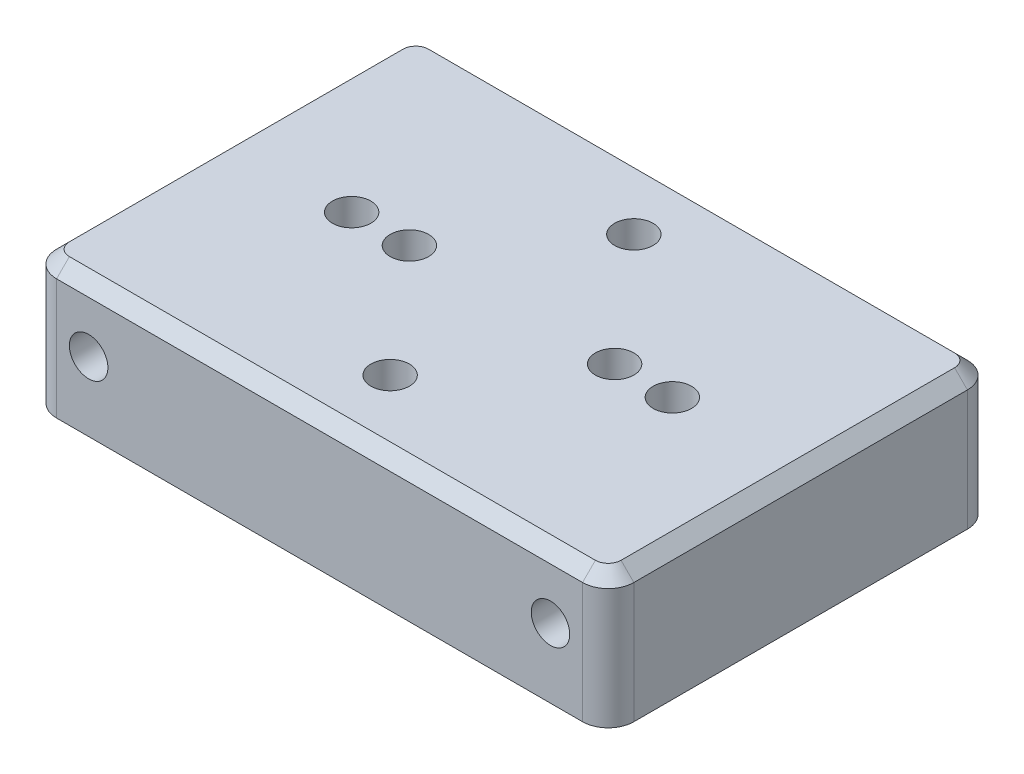
ISO-10303-21;
HEADER;
FILE_DESCRIPTION(('STEP AP214'),'2;1');
FILE_NAME('part.step','',(''),(''),'','','');
FILE_SCHEMA(('AUTOMOTIVE_DESIGN { 1 0 10303 214 1 1 1 1 }'));
ENDSEC;
DATA;
#1=APPLICATION_CONTEXT('core data for automotive mechanical design processes');
#2=APPLICATION_PROTOCOL_DEFINITION('international standard','automotive_design',2000,#1);
#3=PRODUCT_CONTEXT('',#1,'mechanical');
#4=PRODUCT('Part','Part','',(#3));
#5=PRODUCT_RELATED_PRODUCT_CATEGORY('part','',(#4));
#6=PRODUCT_DEFINITION_FORMATION('','',#4);
#7=PRODUCT_DEFINITION_CONTEXT('part definition',#1,'design');
#8=PRODUCT_DEFINITION('design','',#6,#7);
#9=PRODUCT_DEFINITION_SHAPE('','',#8);
#10=(LENGTH_UNIT() NAMED_UNIT(*) SI_UNIT(.MILLI.,.METRE.));
#11=(NAMED_UNIT(*) PLANE_ANGLE_UNIT() SI_UNIT($,.RADIAN.));
#12=(NAMED_UNIT(*) SI_UNIT($,.STERADIAN.) SOLID_ANGLE_UNIT());
#13=UNCERTAINTY_MEASURE_WITH_UNIT(LENGTH_MEASURE(1.E-05),#10,'distance_accuracy_value','');
#14=(GEOMETRIC_REPRESENTATION_CONTEXT(3) GLOBAL_UNCERTAINTY_ASSIGNED_CONTEXT((#13)) GLOBAL_UNIT_ASSIGNED_CONTEXT((#10,
#11,#12)) REPRESENTATION_CONTEXT('',''));
#15=CARTESIAN_POINT('',(0.,0.,0.));
#16=DIRECTION('',(0.,0.,1.));
#17=DIRECTION('',(1.,0.,0.));
#18=AXIS2_PLACEMENT_3D('',#15,#16,#17);
#19=CARTESIAN_POINT('',(0.,10.,0.));
#20=DIRECTION('',(0.,-1.,0.));
#21=DIRECTION('',(0.,0.,-1.));
#22=AXIS2_PLACEMENT_3D('',#19,#20,#21);
#23=PLANE('',#22);
#24=DIRECTION('',(0.,0.,-1.));
#25=VECTOR('',#24,1.);
#26=CARTESIAN_POINT('',(21.5,10.,0.));
#27=LINE('',#26,#25);
#28=CARTESIAN_POINT('',(21.5,10.,13.));
#29=VERTEX_POINT('',#28);
#30=CARTESIAN_POINT('',(21.5,10.,-13.));
#31=VERTEX_POINT('',#30);
#32=EDGE_CURVE('E236',#29,#31,#27,.T.);
#33=ORIENTED_EDGE('',*,*,#32,.T.);
#34=CARTESIAN_POINT('',(20.5,10.,-13.));
#35=DIRECTION('',(0.,-1.,0.));
#36=DIRECTION('',(0.,0.,-1.));
#37=AXIS2_PLACEMENT_3D('',#34,#35,#36);
#38=CIRCLE('',#37,0.999999999999996);
#39=CARTESIAN_POINT('',(20.5,10.,-14.));
#40=VERTEX_POINT('',#39);
#41=EDGE_CURVE('E240',#31,#40,#38,.F.);
#42=ORIENTED_EDGE('',*,*,#41,.T.);
#43=DIRECTION('',(-1.,0.,0.));
#44=VECTOR('',#43,1.);
#45=CARTESIAN_POINT('',(0.,10.,-14.));
#46=LINE('',#45,#44);
#47=CARTESIAN_POINT('',(-20.5,10.,-14.));
#48=VERTEX_POINT('',#47);
#49=EDGE_CURVE('E238',#40,#48,#46,.T.);
#50=ORIENTED_EDGE('',*,*,#49,.T.);
#51=CARTESIAN_POINT('',(-20.5,10.,-13.));
#52=DIRECTION('',(0.,-1.,0.));
#53=DIRECTION('',(0.,0.,-1.));
#54=AXIS2_PLACEMENT_3D('',#51,#52,#53);
#55=CIRCLE('',#54,0.999999999999997);
#56=CARTESIAN_POINT('',(-21.5,10.,-13.));
#57=VERTEX_POINT('',#56);
#58=EDGE_CURVE('E234',#48,#57,#55,.F.);
#59=ORIENTED_EDGE('',*,*,#58,.T.);
#60=DIRECTION('',(0.,0.,1.));
#61=VECTOR('',#60,1.);
#62=CARTESIAN_POINT('',(-21.5,10.,0.));
#63=LINE('',#62,#61);
#64=CARTESIAN_POINT('',(-21.5,10.,13.));
#65=VERTEX_POINT('',#64);
#66=EDGE_CURVE('E230',#57,#65,#63,.T.);
#67=ORIENTED_EDGE('',*,*,#66,.T.);
#68=CARTESIAN_POINT('',(-20.5,10.,13.));
#69=DIRECTION('',(0.,-1.,0.));
#70=DIRECTION('',(0.,0.,-1.));
#71=AXIS2_PLACEMENT_3D('',#68,#69,#70);
#72=CIRCLE('',#71,0.999999999999996);
#73=CARTESIAN_POINT('',(-20.5,10.,14.));
#74=VERTEX_POINT('',#73);
#75=EDGE_CURVE('E226',#65,#74,#72,.F.);
#76=ORIENTED_EDGE('',*,*,#75,.T.);
#77=DIRECTION('',(1.,0.,0.));
#78=VECTOR('',#77,1.);
#79=CARTESIAN_POINT('',(0.,10.,14.));
#80=LINE('',#79,#78);
#81=CARTESIAN_POINT('',(20.5,10.,14.));
#82=VERTEX_POINT('',#81);
#83=EDGE_CURVE('E228',#74,#82,#80,.T.);
#84=ORIENTED_EDGE('',*,*,#83,.T.);
#85=CARTESIAN_POINT('',(20.5,10.,13.));
#86=DIRECTION('',(0.,-1.,0.));
#87=DIRECTION('',(0.,0.,-1.));
#88=AXIS2_PLACEMENT_3D('',#85,#86,#87);
#89=CIRCLE('',#88,0.999999999999997);
#90=EDGE_CURVE('E232',#82,#29,#89,.F.);
#91=ORIENTED_EDGE('',*,*,#90,.T.);
#92=EDGE_LOOP('',(#33,#42,#50,#59,#67,#76,#84,#91));
#93=FACE_BOUND('',#92,.T.);
#94=CARTESIAN_POINT('',(-8.,10.,0.));
#95=DIRECTION('',(0.,1.,0.));
#96=DIRECTION('',(0.,0.,1.));
#97=AXIS2_PLACEMENT_3D('',#94,#95,#96);
#98=CIRCLE('',#97,1.5);
#99=CARTESIAN_POINT('',(-8.,10.,1.5));
#100=VERTEX_POINT('',#99);
#101=EDGE_CURVE('E142',#100,#100,#98,.T.);
#102=ORIENTED_EDGE('',*,*,#101,.F.);
#103=EDGE_LOOP('',(#102));
#104=FACE_BOUND('',#103,.T.);
#105=CARTESIAN_POINT('',(0.,10.,-9.5));
#106=DIRECTION('',(0.,1.,0.));
#107=DIRECTION('',(0.,0.,1.));
#108=AXIS2_PLACEMENT_3D('',#105,#106,#107);
#109=CIRCLE('',#108,1.5);
#110=CARTESIAN_POINT('',(0.,10.,-8.));
#111=VERTEX_POINT('',#110);
#112=EDGE_CURVE('E205',#111,#111,#109,.T.);
#113=ORIENTED_EDGE('',*,*,#112,.F.);
#114=EDGE_LOOP('',(#113));
#115=FACE_BOUND('',#114,.T.);
#116=CARTESIAN_POINT('',(8.,10.,0.));
#117=DIRECTION('',(0.,1.,0.));
#118=DIRECTION('',(0.,0.,1.));
#119=AXIS2_PLACEMENT_3D('',#116,#117,#118);
#120=CIRCLE('',#119,1.5);
#121=CARTESIAN_POINT('',(8.,10.,1.5));
#122=VERTEX_POINT('',#121);
#123=EDGE_CURVE('E202',#122,#122,#120,.T.);
#124=ORIENTED_EDGE('',*,*,#123,.F.);
#125=EDGE_LOOP('',(#124));
#126=FACE_BOUND('',#125,.T.);
#127=CARTESIAN_POINT('',(0.,10.,9.5));
#128=DIRECTION('',(0.,1.,0.));
#129=DIRECTION('',(0.,0.,1.));
#130=AXIS2_PLACEMENT_3D('',#127,#128,#129);
#131=CIRCLE('',#130,1.5);
#132=CARTESIAN_POINT('',(0.,10.,11.));
#133=VERTEX_POINT('',#132);
#134=EDGE_CURVE('E199',#133,#133,#131,.T.);
#135=ORIENTED_EDGE('',*,*,#134,.F.);
#136=EDGE_LOOP('',(#135));
#137=FACE_BOUND('',#136,.T.);
#138=CARTESIAN_POINT('',(-12.5,10.,0.));
#139=DIRECTION('',(0.,1.,0.));
#140=DIRECTION('',(0.,0.,1.));
#141=AXIS2_PLACEMENT_3D('',#138,#139,#140);
#142=CIRCLE('',#141,1.5);
#143=CARTESIAN_POINT('',(-12.5,10.,1.5));
#144=VERTEX_POINT('',#143);
#145=EDGE_CURVE('E196',#144,#144,#142,.T.);
#146=ORIENTED_EDGE('',*,*,#145,.F.);
#147=EDGE_LOOP('',(#146));
#148=FACE_BOUND('',#147,.T.);
#149=CARTESIAN_POINT('',(12.5,10.,0.));
#150=DIRECTION('',(0.,1.,0.));
#151=DIRECTION('',(0.,0.,1.));
#152=AXIS2_PLACEMENT_3D('',#149,#150,#151);
#153=CIRCLE('',#152,1.5);
#154=CARTESIAN_POINT('',(12.5,10.,1.5));
#155=VERTEX_POINT('',#154);
#156=EDGE_CURVE('E191',#155,#155,#153,.T.);
#157=ORIENTED_EDGE('',*,*,#156,.F.);
#158=EDGE_LOOP('',(#157));
#159=FACE_BOUND('',#158,.T.);
#160=ADVANCED_FACE('F32',(#93,#104,#115,#126,#137,#148,#159),#23,.F.);
#161=CARTESIAN_POINT('',(22.5,10.,15.));
#162=DIRECTION('',(-1.,0.,0.));
#163=DIRECTION('',(0.,0.,1.));
#164=AXIS2_PLACEMENT_3D('',#161,#162,#163);
#165=PLANE('',#164);
#166=DIRECTION('',(0.,-1.,0.));
#167=VECTOR('',#166,1.);
#168=CARTESIAN_POINT('',(22.5,10.,-13.));
#169=LINE('',#168,#167);
#170=CARTESIAN_POINT('',(22.5,-0.4,-13.));
#171=VERTEX_POINT('',#170);
#172=CARTESIAN_POINT('',(22.5,8.99999999999999,-13.));
#173=VERTEX_POINT('',#172);
#174=EDGE_CURVE('E132',#171,#173,#169,.F.);
#175=ORIENTED_EDGE('',*,*,#174,.T.);
#176=DIRECTION('',(0.,0.,1.));
#177=VECTOR('',#176,1.);
#178=CARTESIAN_POINT('',(22.5,8.99999999999999,15.));
#179=LINE('',#178,#177);
#180=CARTESIAN_POINT('',(22.5,8.99999999999999,13.));
#181=VERTEX_POINT('',#180);
#182=EDGE_CURVE('E246',#173,#181,#179,.T.);
#183=ORIENTED_EDGE('',*,*,#182,.T.);
#184=DIRECTION('',(0.,-1.,0.));
#185=VECTOR('',#184,1.);
#186=CARTESIAN_POINT('',(22.5,10.,13.));
#187=LINE('',#186,#185);
#188=CARTESIAN_POINT('',(22.5,-0.4,13.));
#189=VERTEX_POINT('',#188);
#190=EDGE_CURVE('E141',#181,#189,#187,.T.);
#191=ORIENTED_EDGE('',*,*,#190,.T.);
#192=DIRECTION('',(0.,0.,1.));
#193=VECTOR('',#192,1.);
#194=CARTESIAN_POINT('',(22.5,-0.4,-13.));
#195=LINE('',#194,#193);
#196=EDGE_CURVE('E145',#171,#189,#195,.T.);
#197=ORIENTED_EDGE('',*,*,#196,.F.);
#198=EDGE_LOOP('',(#175,#183,#191,#197));
#199=FACE_BOUND('',#198,.T.);
#200=ADVANCED_FACE('F146',(#199),#165,.F.);
#201=CARTESIAN_POINT('',(-22.5,10.,-15.));
#202=DIRECTION('',(0.,0.,1.));
#203=DIRECTION('',(1.,0.,0.));
#204=AXIS2_PLACEMENT_3D('',#201,#202,#203);
#205=PLANE('',#204);
#206=CARTESIAN_POINT('',(18.,5.,-15.));
#207=DIRECTION('',(0.,0.,1.));
#208=DIRECTION('',(-1.,0.,0.));
#209=AXIS2_PLACEMENT_3D('',#206,#207,#208);
#210=CIRCLE('',#209,1.5);
#211=CARTESIAN_POINT('',(16.5,5.,-15.));
#212=VERTEX_POINT('',#211);
#213=EDGE_CURVE('E180',#212,#212,#210,.T.);
#214=ORIENTED_EDGE('',*,*,#213,.T.);
#215=EDGE_LOOP('',(#214));
#216=FACE_BOUND('',#215,.T.);
#217=CARTESIAN_POINT('',(-18.,5.,-15.));
#218=DIRECTION('',(0.,0.,1.));
#219=DIRECTION('',(1.,0.,0.));
#220=AXIS2_PLACEMENT_3D('',#217,#218,#219);
#221=CIRCLE('',#220,1.5);
#222=CARTESIAN_POINT('',(-16.5,5.,-15.));
#223=VERTEX_POINT('',#222);
#224=EDGE_CURVE('E188',#223,#223,#221,.T.);
#225=ORIENTED_EDGE('',*,*,#224,.T.);
#226=EDGE_LOOP('',(#225));
#227=FACE_BOUND('',#226,.T.);
#228=DIRECTION('',(0.,-1.,0.));
#229=VECTOR('',#228,1.);
#230=CARTESIAN_POINT('',(-20.5,10.,-15.));
#231=LINE('',#230,#229);
#232=CARTESIAN_POINT('',(-20.5,-0.4,-15.));
#233=VERTEX_POINT('',#232);
#234=CARTESIAN_POINT('',(-20.5,8.99999999999999,-15.));
#235=VERTEX_POINT('',#234);
#236=EDGE_CURVE('E216',#233,#235,#231,.F.);
#237=ORIENTED_EDGE('',*,*,#236,.T.);
#238=DIRECTION('',(1.,0.,0.));
#239=VECTOR('',#238,1.);
#240=CARTESIAN_POINT('',(-22.5,8.99999999999999,-15.));
#241=LINE('',#240,#239);
#242=CARTESIAN_POINT('',(20.5,8.99999999999999,-15.));
#243=VERTEX_POINT('',#242);
#244=EDGE_CURVE('E244',#235,#243,#241,.T.);
#245=ORIENTED_EDGE('',*,*,#244,.T.);
#246=DIRECTION('',(0.,-1.,0.));
#247=VECTOR('',#246,1.);
#248=CARTESIAN_POINT('',(20.5,10.,-15.));
#249=LINE('',#248,#247);
#250=CARTESIAN_POINT('',(20.5,-0.4,-15.));
#251=VERTEX_POINT('',#250);
#252=EDGE_CURVE('E219',#243,#251,#249,.T.);
#253=ORIENTED_EDGE('',*,*,#252,.T.);
#254=DIRECTION('',(1.,0.,0.));
#255=VECTOR('',#254,1.);
#256=CARTESIAN_POINT('',(-20.5,-0.4,-15.));
#257=LINE('',#256,#255);
#258=EDGE_CURVE('E158',#233,#251,#257,.T.);
#259=ORIENTED_EDGE('',*,*,#258,.F.);
#260=EDGE_LOOP('',(#237,#245,#253,#259));
#261=FACE_BOUND('',#260,.T.);
#262=ADVANCED_FACE('F340',(#216,#227,#261),#205,.F.);
#263=CARTESIAN_POINT('',(-22.5,10.,15.));
#264=DIRECTION('',(1.,0.,0.));
#265=DIRECTION('',(0.,0.,-1.));
#266=AXIS2_PLACEMENT_3D('',#263,#264,#265);
#267=PLANE('',#266);
#268=DIRECTION('',(0.,-1.,0.));
#269=VECTOR('',#268,1.);
#270=CARTESIAN_POINT('',(-22.5,10.,13.));
#271=LINE('',#270,#269);
#272=CARTESIAN_POINT('',(-22.5,-0.4,13.));
#273=VERTEX_POINT('',#272);
#274=CARTESIAN_POINT('',(-22.5,8.99999999999999,13.));
#275=VERTEX_POINT('',#274);
#276=EDGE_CURVE('E221',#273,#275,#271,.F.);
#277=ORIENTED_EDGE('',*,*,#276,.T.);
#278=DIRECTION('',(0.,0.,-1.));
#279=VECTOR('',#278,1.);
#280=CARTESIAN_POINT('',(-22.5,8.99999999999999,15.));
#281=LINE('',#280,#279);
#282=CARTESIAN_POINT('',(-22.5,8.99999999999999,-13.));
#283=VERTEX_POINT('',#282);
#284=EDGE_CURVE('E252',#275,#283,#281,.T.);
#285=ORIENTED_EDGE('',*,*,#284,.T.);
#286=DIRECTION('',(0.,-1.,0.));
#287=VECTOR('',#286,1.);
#288=CARTESIAN_POINT('',(-22.5,10.,-13.));
#289=LINE('',#288,#287);
#290=CARTESIAN_POINT('',(-22.5,-0.4,-13.));
#291=VERTEX_POINT('',#290);
#292=EDGE_CURVE('E224',#283,#291,#289,.T.);
#293=ORIENTED_EDGE('',*,*,#292,.T.);
#294=DIRECTION('',(0.,0.,-1.));
#295=VECTOR('',#294,1.);
#296=CARTESIAN_POINT('',(-22.5,-0.4,13.));
#297=LINE('',#296,#295);
#298=EDGE_CURVE('E173',#273,#291,#297,.T.);
#299=ORIENTED_EDGE('',*,*,#298,.F.);
#300=EDGE_LOOP('',(#277,#285,#293,#299));
#301=FACE_BOUND('',#300,.T.);
#302=ADVANCED_FACE('F350',(#301),#267,.F.);
#303=CARTESIAN_POINT('',(-22.5,10.,15.));
#304=DIRECTION('',(0.,0.,-1.));
#305=DIRECTION('',(-1.,0.,0.));
#306=AXIS2_PLACEMENT_3D('',#303,#304,#305);
#307=PLANE('',#306);
#308=CARTESIAN_POINT('',(18.,5.,15.));
#309=DIRECTION('',(0.,0.,1.));
#310=DIRECTION('',(-1.,0.,0.));
#311=AXIS2_PLACEMENT_3D('',#308,#309,#310);
#312=CIRCLE('',#311,1.5);
#313=CARTESIAN_POINT('',(16.5,5.,15.));
#314=VERTEX_POINT('',#313);
#315=EDGE_CURVE('E184',#314,#314,#312,.T.);
#316=ORIENTED_EDGE('',*,*,#315,.F.);
#317=EDGE_LOOP('',(#316));
#318=FACE_BOUND('',#317,.T.);
#319=CARTESIAN_POINT('',(-18.,5.,15.));
#320=DIRECTION('',(0.,0.,1.));
#321=DIRECTION('',(1.,0.,0.));
#322=AXIS2_PLACEMENT_3D('',#319,#320,#321);
#323=CIRCLE('',#322,1.5);
#324=CARTESIAN_POINT('',(-16.5,5.,15.));
#325=VERTEX_POINT('',#324);
#326=EDGE_CURVE('E183',#325,#325,#323,.T.);
#327=ORIENTED_EDGE('',*,*,#326,.F.);
#328=EDGE_LOOP('',(#327));
#329=FACE_BOUND('',#328,.T.);
#330=DIRECTION('',(0.,-1.,0.));
#331=VECTOR('',#330,1.);
#332=CARTESIAN_POINT('',(20.5,10.,15.));
#333=LINE('',#332,#331);
#334=CARTESIAN_POINT('',(20.5,-0.4,15.));
#335=VERTEX_POINT('',#334);
#336=CARTESIAN_POINT('',(20.5,8.99999999999999,15.));
#337=VERTEX_POINT('',#336);
#338=EDGE_CURVE('E213',#335,#337,#333,.F.);
#339=ORIENTED_EDGE('',*,*,#338,.T.);
#340=DIRECTION('',(-1.,0.,0.));
#341=VECTOR('',#340,1.);
#342=CARTESIAN_POINT('',(-22.5,8.99999999999999,15.));
#343=LINE('',#342,#341);
#344=CARTESIAN_POINT('',(-20.5,8.99999999999999,15.));
#345=VERTEX_POINT('',#344);
#346=EDGE_CURVE('E254',#337,#345,#343,.T.);
#347=ORIENTED_EDGE('',*,*,#346,.T.);
#348=DIRECTION('',(0.,-1.,0.));
#349=VECTOR('',#348,1.);
#350=CARTESIAN_POINT('',(-20.5,10.,15.));
#351=LINE('',#350,#349);
#352=CARTESIAN_POINT('',(-20.5,-0.4,15.));
#353=VERTEX_POINT('',#352);
#354=EDGE_CURVE('E211',#345,#353,#351,.T.);
#355=ORIENTED_EDGE('',*,*,#354,.T.);
#356=DIRECTION('',(-1.,0.,0.));
#357=VECTOR('',#356,1.);
#358=CARTESIAN_POINT('',(20.5,-0.4,15.));
#359=LINE('',#358,#357);
#360=EDGE_CURVE('E167',#335,#353,#359,.T.);
#361=ORIENTED_EDGE('',*,*,#360,.F.);
#362=EDGE_LOOP('',(#339,#347,#355,#361));
#363=FACE_BOUND('',#362,.T.);
#364=ADVANCED_FACE('F347',(#318,#329,#363),#307,.F.);
#365=CARTESIAN_POINT('',(-8.,10.,0.));
#366=DIRECTION('',(0.,-1.,0.));
#367=DIRECTION('',(0.,0.,-1.));
#368=AXIS2_PLACEMENT_3D('',#365,#366,#367);
#369=CYLINDRICAL_SURFACE('',#368,1.5);
#370=ORIENTED_EDGE('',*,*,#101,.T.);
#371=EDGE_LOOP('',(#370));
#372=FACE_BOUND('',#371,.T.);
#373=CARTESIAN_POINT('',(-8.,-0.4,0.));
#374=DIRECTION('',(0.,-1.,0.));
#375=DIRECTION('',(0.,0.,-1.));
#376=AXIS2_PLACEMENT_3D('',#373,#374,#375);
#377=CIRCLE('',#376,1.5);
#378=CARTESIAN_POINT('',(-8.,-0.4,-1.5));
#379=VERTEX_POINT('',#378);
#380=EDGE_CURVE('E306',#379,#379,#377,.T.);
#381=ORIENTED_EDGE('',*,*,#380,.T.);
#382=EDGE_LOOP('',(#381));
#383=FACE_BOUND('',#382,.T.);
#384=ADVANCED_FACE('F345',(#372,#383),#369,.F.);
#385=CARTESIAN_POINT('',(0.,10.,-9.5));
#386=DIRECTION('',(0.,-1.,0.));
#387=DIRECTION('',(0.,0.,-1.));
#388=AXIS2_PLACEMENT_3D('',#385,#386,#387);
#389=CYLINDRICAL_SURFACE('',#388,1.5);
#390=ORIENTED_EDGE('',*,*,#112,.T.);
#391=EDGE_LOOP('',(#390));
#392=FACE_BOUND('',#391,.T.);
#393=CARTESIAN_POINT('',(0.,-0.4,-9.5));
#394=DIRECTION('',(0.,-1.,0.));
#395=DIRECTION('',(0.,0.,-1.));
#396=AXIS2_PLACEMENT_3D('',#393,#394,#395);
#397=CIRCLE('',#396,1.5);
#398=CARTESIAN_POINT('',(0.,-0.4,-11.));
#399=VERTEX_POINT('',#398);
#400=EDGE_CURVE('E303',#399,#399,#397,.T.);
#401=ORIENTED_EDGE('',*,*,#400,.T.);
#402=EDGE_LOOP('',(#401));
#403=FACE_BOUND('',#402,.T.);
#404=ADVANCED_FACE('F568',(#392,#403),#389,.F.);
#405=CARTESIAN_POINT('',(8.,10.,0.));
#406=DIRECTION('',(0.,-1.,0.));
#407=DIRECTION('',(0.,0.,-1.));
#408=AXIS2_PLACEMENT_3D('',#405,#406,#407);
#409=CYLINDRICAL_SURFACE('',#408,1.5);
#410=ORIENTED_EDGE('',*,*,#123,.T.);
#411=EDGE_LOOP('',(#410));
#412=FACE_BOUND('',#411,.T.);
#413=CARTESIAN_POINT('',(8.,-0.4,0.));
#414=DIRECTION('',(0.,-1.,0.));
#415=DIRECTION('',(0.,0.,-1.));
#416=AXIS2_PLACEMENT_3D('',#413,#414,#415);
#417=CIRCLE('',#416,1.5);
#418=CARTESIAN_POINT('',(8.,-0.4,-1.5));
#419=VERTEX_POINT('',#418);
#420=EDGE_CURVE('E300',#419,#419,#417,.T.);
#421=ORIENTED_EDGE('',*,*,#420,.T.);
#422=EDGE_LOOP('',(#421));
#423=FACE_BOUND('',#422,.T.);
#424=ADVANCED_FACE('F556',(#412,#423),#409,.F.);
#425=CARTESIAN_POINT('',(0.,10.,9.5));
#426=DIRECTION('',(0.,-1.,0.));
#427=DIRECTION('',(0.,0.,-1.));
#428=AXIS2_PLACEMENT_3D('',#425,#426,#427);
#429=CYLINDRICAL_SURFACE('',#428,1.5);
#430=ORIENTED_EDGE('',*,*,#134,.T.);
#431=EDGE_LOOP('',(#430));
#432=FACE_BOUND('',#431,.T.);
#433=CARTESIAN_POINT('',(0.,-0.4,9.5));
#434=DIRECTION('',(0.,-1.,0.));
#435=DIRECTION('',(0.,0.,-1.));
#436=AXIS2_PLACEMENT_3D('',#433,#434,#435);
#437=CIRCLE('',#436,1.5);
#438=CARTESIAN_POINT('',(0.,-0.4,8.));
#439=VERTEX_POINT('',#438);
#440=EDGE_CURVE('E292',#439,#439,#437,.T.);
#441=ORIENTED_EDGE('',*,*,#440,.T.);
#442=EDGE_LOOP('',(#441));
#443=FACE_BOUND('',#442,.T.);
#444=ADVANCED_FACE('F331',(#432,#443),#429,.F.);
#445=CARTESIAN_POINT('',(-12.5,10.,0.));
#446=DIRECTION('',(0.,-1.,0.));
#447=DIRECTION('',(0.,0.,-1.));
#448=AXIS2_PLACEMENT_3D('',#445,#446,#447);
#449=CYLINDRICAL_SURFACE('',#448,1.5);
#450=ORIENTED_EDGE('',*,*,#145,.T.);
#451=EDGE_LOOP('',(#450));
#452=FACE_BOUND('',#451,.T.);
#453=CARTESIAN_POINT('',(-12.5,-0.4,0.));
#454=DIRECTION('',(0.,-1.,0.));
#455=DIRECTION('',(0.,0.,-1.));
#456=AXIS2_PLACEMENT_3D('',#453,#454,#455);
#457=CIRCLE('',#456,1.5);
#458=CARTESIAN_POINT('',(-12.5,-0.4,-1.5));
#459=VERTEX_POINT('',#458);
#460=EDGE_CURVE('E162',#459,#459,#457,.T.);
#461=ORIENTED_EDGE('',*,*,#460,.T.);
#462=EDGE_LOOP('',(#461));
#463=FACE_BOUND('',#462,.T.);
#464=ADVANCED_FACE('F311',(#452,#463),#449,.F.);
#465=CARTESIAN_POINT('',(12.5,10.,0.));
#466=DIRECTION('',(0.,-1.,0.));
#467=DIRECTION('',(0.,0.,-1.));
#468=AXIS2_PLACEMENT_3D('',#465,#466,#467);
#469=CYLINDRICAL_SURFACE('',#468,1.5);
#470=ORIENTED_EDGE('',*,*,#156,.T.);
#471=EDGE_LOOP('',(#470));
#472=FACE_BOUND('',#471,.T.);
#473=CARTESIAN_POINT('',(12.5,-0.4,0.));
#474=DIRECTION('',(0.,-1.,0.));
#475=DIRECTION('',(0.,0.,-1.));
#476=AXIS2_PLACEMENT_3D('',#473,#474,#475);
#477=CIRCLE('',#476,1.5);
#478=CARTESIAN_POINT('',(12.5,-0.4,-1.5));
#479=VERTEX_POINT('',#478);
#480=EDGE_CURVE('E295',#479,#479,#477,.T.);
#481=ORIENTED_EDGE('',*,*,#480,.T.);
#482=EDGE_LOOP('',(#481));
#483=FACE_BOUND('',#482,.T.);
#484=ADVANCED_FACE('F320',(#472,#483),#469,.F.);
#485=CARTESIAN_POINT('',(-18.,5.,-15.));
#486=DIRECTION('',(0.,0.,1.));
#487=DIRECTION('',(1.,0.,0.));
#488=AXIS2_PLACEMENT_3D('',#485,#486,#487);
#489=CYLINDRICAL_SURFACE('',#488,1.5);
#490=CARTESIAN_POINT('',(-18.,5.,0.));
#491=DIRECTION('',(0.,0.707106781186547,0.707106781186547));
#492=DIRECTION('',(0.,-0.707106781186547,0.707106781186547));
#493=AXIS2_PLACEMENT_3D('',#490,#491,#492);
#494=ELLIPSE('',#493,2.12132034355964,1.5);
#495=CARTESIAN_POINT('',(-16.5,5.,0.));
#496=VERTEX_POINT('',#495);
#497=CARTESIAN_POINT('',(-19.5,5.,0.));
#498=VERTEX_POINT('',#497);
#499=EDGE_CURVE('E258',#496,#498,#494,.F.);
#500=ORIENTED_EDGE('',*,*,#499,.T.);
#501=CARTESIAN_POINT('',(-18.,5.,0.));
#502=DIRECTION('',(0.,-0.707106781186547,0.707106781186547));
#503=DIRECTION('',(0.,0.707106781186547,0.707106781186547));
#504=AXIS2_PLACEMENT_3D('',#501,#502,#503);
#505=ELLIPSE('',#504,2.12132034355964,1.5);
#506=EDGE_CURVE('E51',#498,#496,#505,.T.);
#507=ORIENTED_EDGE('',*,*,#506,.T.);
#508=EDGE_LOOP('',(#500,#507));
#509=FACE_BOUND('',#508,.T.);
#510=ORIENTED_EDGE('',*,*,#224,.F.);
#511=EDGE_LOOP('',(#510));
#512=FACE_BOUND('',#511,.T.);
#513=ORIENTED_EDGE('',*,*,#326,.T.);
#514=EDGE_LOOP('',(#513));
#515=FACE_BOUND('',#514,.T.);
#516=ADVANCED_FACE('F322',(#509,#512,#515),#489,.F.);
#517=CARTESIAN_POINT('',(18.,5.,-15.));
#518=DIRECTION('',(0.,0.,1.));
#519=DIRECTION('',(1.,0.,0.));
#520=AXIS2_PLACEMENT_3D('',#517,#518,#519);
#521=CYLINDRICAL_SURFACE('',#520,1.5);
#522=CARTESIAN_POINT('',(18.,5.,0.));
#523=DIRECTION('',(0.,0.707106781186547,0.707106781186547));
#524=DIRECTION('',(0.,-0.707106781186547,0.707106781186547));
#525=AXIS2_PLACEMENT_3D('',#522,#523,#524);
#526=ELLIPSE('',#525,2.12132034355964,1.5);
#527=CARTESIAN_POINT('',(19.5,5.,0.));
#528=VERTEX_POINT('',#527);
#529=CARTESIAN_POINT('',(16.5,5.,0.));
#530=VERTEX_POINT('',#529);
#531=EDGE_CURVE('E40',#528,#530,#526,.F.);
#532=ORIENTED_EDGE('',*,*,#531,.T.);
#533=CARTESIAN_POINT('',(18.,5.,0.));
#534=DIRECTION('',(0.,-0.707106781186547,0.707106781186547));
#535=DIRECTION('',(0.,0.707106781186547,0.707106781186547));
#536=AXIS2_PLACEMENT_3D('',#533,#534,#535);
#537=ELLIPSE('',#536,2.12132034355964,1.5);
#538=EDGE_CURVE('E11',#530,#528,#537,.T.);
#539=ORIENTED_EDGE('',*,*,#538,.T.);
#540=EDGE_LOOP('',(#532,#539));
#541=FACE_BOUND('',#540,.T.);
#542=ORIENTED_EDGE('',*,*,#213,.F.);
#543=EDGE_LOOP('',(#542));
#544=FACE_BOUND('',#543,.T.);
#545=ORIENTED_EDGE('',*,*,#315,.T.);
#546=EDGE_LOOP('',(#545));
#547=FACE_BOUND('',#546,.T.);
#548=ADVANCED_FACE('F281',(#541,#544,#547),#521,.F.);
#549=CARTESIAN_POINT('',(20.5,10.,13.));
#550=DIRECTION('',(0.,-1.,0.));
#551=DIRECTION('',(0.,0.,-1.));
#552=AXIS2_PLACEMENT_3D('',#549,#550,#551);
#553=CYLINDRICAL_SURFACE('',#552,2.);
#554=ORIENTED_EDGE('',*,*,#190,.F.);
#555=CARTESIAN_POINT('',(20.5,8.99999999999999,13.));
#556=DIRECTION('',(0.,-1.,0.));
#557=DIRECTION('',(0.,0.,-1.));
#558=AXIS2_PLACEMENT_3D('',#555,#556,#557);
#559=CIRCLE('',#558,2.);
#560=EDGE_CURVE('E250',#181,#337,#559,.T.);
#561=ORIENTED_EDGE('',*,*,#560,.T.);
#562=ORIENTED_EDGE('',*,*,#338,.F.);
#563=CARTESIAN_POINT('',(20.5,-0.4,13.));
#564=DIRECTION('',(0.,-1.,0.));
#565=DIRECTION('',(0.,0.,-1.));
#566=AXIS2_PLACEMENT_3D('',#563,#564,#565);
#567=CIRCLE('',#566,2.);
#568=EDGE_CURVE('E151',#189,#335,#567,.T.);
#569=ORIENTED_EDGE('',*,*,#568,.F.);
#570=EDGE_LOOP('',(#554,#561,#562,#569));
#571=FACE_BOUND('',#570,.T.);
#572=ADVANCED_FACE('F358',(#571),#553,.T.);
#573=CARTESIAN_POINT('',(20.5,10.,-13.));
#574=DIRECTION('',(0.,-1.,0.));
#575=DIRECTION('',(0.,0.,-1.));
#576=AXIS2_PLACEMENT_3D('',#573,#574,#575);
#577=CYLINDRICAL_SURFACE('',#576,2.);
#578=ORIENTED_EDGE('',*,*,#252,.F.);
#579=CARTESIAN_POINT('',(20.5,8.99999999999999,-13.));
#580=DIRECTION('',(0.,-1.,0.));
#581=DIRECTION('',(0.,0.,-1.));
#582=AXIS2_PLACEMENT_3D('',#579,#580,#581);
#583=CIRCLE('',#582,2.);
#584=EDGE_CURVE('E139',#243,#173,#583,.T.);
#585=ORIENTED_EDGE('',*,*,#584,.T.);
#586=ORIENTED_EDGE('',*,*,#174,.F.);
#587=CARTESIAN_POINT('',(20.5,-0.4,-13.));
#588=DIRECTION('',(0.,-1.,0.));
#589=DIRECTION('',(0.,0.,-1.));
#590=AXIS2_PLACEMENT_3D('',#587,#588,#589);
#591=CIRCLE('',#590,2.);
#592=EDGE_CURVE('E137',#251,#171,#591,.T.);
#593=ORIENTED_EDGE('',*,*,#592,.F.);
#594=EDGE_LOOP('',(#578,#585,#586,#593));
#595=FACE_BOUND('',#594,.T.);
#596=ADVANCED_FACE('F135',(#595),#577,.T.);
#597=CARTESIAN_POINT('',(-20.5,10.,-13.));
#598=DIRECTION('',(0.,-1.,0.));
#599=DIRECTION('',(0.,0.,-1.));
#600=AXIS2_PLACEMENT_3D('',#597,#598,#599);
#601=CYLINDRICAL_SURFACE('',#600,2.);
#602=ORIENTED_EDGE('',*,*,#292,.F.);
#603=CARTESIAN_POINT('',(-20.5,8.99999999999999,-13.));
#604=DIRECTION('',(0.,-1.,0.));
#605=DIRECTION('',(0.,0.,-1.));
#606=AXIS2_PLACEMENT_3D('',#603,#604,#605);
#607=CIRCLE('',#606,2.);
#608=EDGE_CURVE('E248',#283,#235,#607,.T.);
#609=ORIENTED_EDGE('',*,*,#608,.T.);
#610=ORIENTED_EDGE('',*,*,#236,.F.);
#611=CARTESIAN_POINT('',(-20.5,-0.4,-13.));
#612=DIRECTION('',(0.,-1.,0.));
#613=DIRECTION('',(0.,0.,-1.));
#614=AXIS2_PLACEMENT_3D('',#611,#612,#613);
#615=CIRCLE('',#614,2.);
#616=EDGE_CURVE('E176',#291,#233,#615,.T.);
#617=ORIENTED_EDGE('',*,*,#616,.F.);
#618=EDGE_LOOP('',(#602,#609,#610,#617));
#619=FACE_BOUND('',#618,.T.);
#620=ADVANCED_FACE('F364',(#619),#601,.T.);
#621=CARTESIAN_POINT('',(-20.5,10.,13.));
#622=DIRECTION('',(0.,-1.,0.));
#623=DIRECTION('',(0.,0.,-1.));
#624=AXIS2_PLACEMENT_3D('',#621,#622,#623);
#625=CYLINDRICAL_SURFACE('',#624,2.);
#626=ORIENTED_EDGE('',*,*,#354,.F.);
#627=CARTESIAN_POINT('',(-20.5,8.99999999999999,13.));
#628=DIRECTION('',(0.,-1.,0.));
#629=DIRECTION('',(0.,0.,-1.));
#630=AXIS2_PLACEMENT_3D('',#627,#628,#629);
#631=CIRCLE('',#630,2.);
#632=EDGE_CURVE('E256',#345,#275,#631,.T.);
#633=ORIENTED_EDGE('',*,*,#632,.T.);
#634=ORIENTED_EDGE('',*,*,#276,.F.);
#635=CARTESIAN_POINT('',(-20.5,-0.4,13.));
#636=DIRECTION('',(0.,-1.,0.));
#637=DIRECTION('',(0.,0.,-1.));
#638=AXIS2_PLACEMENT_3D('',#635,#636,#637);
#639=CIRCLE('',#638,2.);
#640=EDGE_CURVE('E170',#353,#273,#639,.T.);
#641=ORIENTED_EDGE('',*,*,#640,.F.);
#642=EDGE_LOOP('',(#626,#633,#634,#641));
#643=FACE_BOUND('',#642,.T.);
#644=ADVANCED_FACE('F367',(#643),#625,.T.);
#645=CARTESIAN_POINT('',(-20.5,10.,13.));
#646=DIRECTION('',(0.,-1.,0.));
#647=DIRECTION('',(0.,0.,-1.));
#648=AXIS2_PLACEMENT_3D('',#645,#646,#647);
#649=CONICAL_SURFACE('',#648,0.999999999999996,0.785398163397447);
#650=DIRECTION('',(0.707106781186547,0.707106781186548,0.));
#651=VECTOR('',#650,1.);
#652=CARTESIAN_POINT('',(-22.5,8.99999999999999,13.));
#653=LINE('',#652,#651);
#654=EDGE_CURVE('E274',#275,#65,#653,.T.);
#655=ORIENTED_EDGE('',*,*,#654,.F.);
#656=ORIENTED_EDGE('',*,*,#632,.F.);
#657=DIRECTION('',(0.,-0.707106781186548,0.707106781186547));
#658=VECTOR('',#657,1.);
#659=CARTESIAN_POINT('',(-20.5,10.,14.));
#660=LINE('',#659,#658);
#661=EDGE_CURVE('E187',#74,#345,#660,.T.);
#662=ORIENTED_EDGE('',*,*,#661,.F.);
#663=ORIENTED_EDGE('',*,*,#75,.F.);
#664=EDGE_LOOP('',(#655,#656,#662,#663));
#665=FACE_BOUND('',#664,.T.);
#666=ADVANCED_FACE('F34',(#665),#649,.T.);
#667=CARTESIAN_POINT('',(0.,10.,14.));
#668=DIRECTION('',(0.,-0.707106781186547,-0.707106781186548));
#669=DIRECTION('',(1.,0.,0.));
#670=AXIS2_PLACEMENT_3D('',#667,#668,#669);
#671=PLANE('',#670);
#672=ORIENTED_EDGE('',*,*,#661,.T.);
#673=ORIENTED_EDGE('',*,*,#346,.F.);
#674=DIRECTION('',(0.,-0.707106781186548,0.707106781186547));
#675=VECTOR('',#674,1.);
#676=CARTESIAN_POINT('',(20.5,10.,14.));
#677=LINE('',#676,#675);
#678=EDGE_CURVE('E271',#82,#337,#677,.T.);
#679=ORIENTED_EDGE('',*,*,#678,.F.);
#680=ORIENTED_EDGE('',*,*,#83,.F.);
#681=EDGE_LOOP('',(#672,#673,#679,#680));
#682=FACE_BOUND('',#681,.T.);
#683=ADVANCED_FACE('F394',(#682),#671,.F.);
#684=CARTESIAN_POINT('',(-21.5,10.,0.));
#685=DIRECTION('',(0.707106781186548,-0.707106781186547,0.));
#686=DIRECTION('',(0.,0.,1.));
#687=AXIS2_PLACEMENT_3D('',#684,#685,#686);
#688=PLANE('',#687);
#689=ORIENTED_EDGE('',*,*,#654,.T.);
#690=ORIENTED_EDGE('',*,*,#66,.F.);
#691=DIRECTION('',(0.707106781186547,0.707106781186548,0.));
#692=VECTOR('',#691,1.);
#693=CARTESIAN_POINT('',(-22.5,8.99999999999999,-13.));
#694=LINE('',#693,#692);
#695=EDGE_CURVE('E268',#283,#57,#694,.T.);
#696=ORIENTED_EDGE('',*,*,#695,.F.);
#697=ORIENTED_EDGE('',*,*,#284,.F.);
#698=EDGE_LOOP('',(#689,#690,#696,#697));
#699=FACE_BOUND('',#698,.T.);
#700=ADVANCED_FACE('F391',(#699),#688,.F.);
#701=CARTESIAN_POINT('',(20.5,10.,13.));
#702=DIRECTION('',(0.,-1.,0.));
#703=DIRECTION('',(0.,0.,-1.));
#704=AXIS2_PLACEMENT_3D('',#701,#702,#703);
#705=CONICAL_SURFACE('',#704,0.999999999999997,0.785398163397447);
#706=ORIENTED_EDGE('',*,*,#678,.T.);
#707=ORIENTED_EDGE('',*,*,#560,.F.);
#708=DIRECTION('',(0.707106781186547,-0.707106781186548,0.));
#709=VECTOR('',#708,1.);
#710=CARTESIAN_POINT('',(21.5,10.,13.));
#711=LINE('',#710,#709);
#712=EDGE_CURVE('E265',#29,#181,#711,.T.);
#713=ORIENTED_EDGE('',*,*,#712,.F.);
#714=ORIENTED_EDGE('',*,*,#90,.F.);
#715=EDGE_LOOP('',(#706,#707,#713,#714));
#716=FACE_BOUND('',#715,.T.);
#717=ADVANCED_FACE('F387',(#716),#705,.T.);
#718=CARTESIAN_POINT('',(-20.5,10.,-13.));
#719=DIRECTION('',(0.,-1.,0.));
#720=DIRECTION('',(0.,0.,-1.));
#721=AXIS2_PLACEMENT_3D('',#718,#719,#720);
#722=CONICAL_SURFACE('',#721,0.999999999999997,0.785398163397447);
#723=ORIENTED_EDGE('',*,*,#695,.T.);
#724=ORIENTED_EDGE('',*,*,#58,.F.);
#725=DIRECTION('',(0.,0.707106781186549,0.707106781186546));
#726=VECTOR('',#725,1.);
#727=CARTESIAN_POINT('',(-20.5,8.99999999999999,-15.));
#728=LINE('',#727,#726);
#729=EDGE_CURVE('E262',#235,#48,#728,.T.);
#730=ORIENTED_EDGE('',*,*,#729,.F.);
#731=ORIENTED_EDGE('',*,*,#608,.F.);
#732=EDGE_LOOP('',(#723,#724,#730,#731));
#733=FACE_BOUND('',#732,.T.);
#734=ADVANCED_FACE('F383',(#733),#722,.T.);
#735=CARTESIAN_POINT('',(21.5,10.,0.));
#736=DIRECTION('',(-0.707106781186548,-0.707106781186547,0.));
#737=DIRECTION('',(0.,0.,-1.));
#738=AXIS2_PLACEMENT_3D('',#735,#736,#737);
#739=PLANE('',#738);
#740=ORIENTED_EDGE('',*,*,#712,.T.);
#741=ORIENTED_EDGE('',*,*,#182,.F.);
#742=DIRECTION('',(0.707106781186547,-0.707106781186548,0.));
#743=VECTOR('',#742,1.);
#744=CARTESIAN_POINT('',(21.5,10.,-13.));
#745=LINE('',#744,#743);
#746=EDGE_CURVE('E260',#31,#173,#745,.T.);
#747=ORIENTED_EDGE('',*,*,#746,.F.);
#748=ORIENTED_EDGE('',*,*,#32,.F.);
#749=EDGE_LOOP('',(#740,#741,#747,#748));
#750=FACE_BOUND('',#749,.T.);
#751=ADVANCED_FACE('F379',(#750),#739,.F.);
#752=CARTESIAN_POINT('',(0.,10.,-14.));
#753=DIRECTION('',(0.,-0.707106781186547,0.707106781186548));
#754=DIRECTION('',(-1.,0.,0.));
#755=AXIS2_PLACEMENT_3D('',#752,#753,#754);
#756=PLANE('',#755);
#757=ORIENTED_EDGE('',*,*,#729,.T.);
#758=ORIENTED_EDGE('',*,*,#49,.F.);
#759=DIRECTION('',(0.,0.707106781186548,0.707106781186548));
#760=VECTOR('',#759,1.);
#761=CARTESIAN_POINT('',(20.5,8.99999999999999,-15.));
#762=LINE('',#761,#760);
#763=EDGE_CURVE('E179',#243,#40,#762,.T.);
#764=ORIENTED_EDGE('',*,*,#763,.F.);
#765=ORIENTED_EDGE('',*,*,#244,.F.);
#766=EDGE_LOOP('',(#757,#758,#764,#765));
#767=FACE_BOUND('',#766,.T.);
#768=ADVANCED_FACE('F375',(#767),#756,.F.);
#769=CARTESIAN_POINT('',(20.5,10.,-13.));
#770=DIRECTION('',(0.,-1.,0.));
#771=DIRECTION('',(0.,0.,-1.));
#772=AXIS2_PLACEMENT_3D('',#769,#770,#771);
#773=CONICAL_SURFACE('',#772,0.999999999999996,0.785398163397447);
#774=ORIENTED_EDGE('',*,*,#746,.T.);
#775=ORIENTED_EDGE('',*,*,#584,.F.);
#776=ORIENTED_EDGE('',*,*,#763,.T.);
#777=ORIENTED_EDGE('',*,*,#41,.F.);
#778=EDGE_LOOP('',(#774,#775,#776,#777));
#779=FACE_BOUND('',#778,.T.);
#780=ADVANCED_FACE('F372',(#779),#773,.T.);
#781=CARTESIAN_POINT('',(-18.,5.,0.));
#782=DIRECTION('',(0.,-1.,0.));
#783=DIRECTION('',(0.,0.,-1.));
#784=AXIS2_PLACEMENT_3D('',#781,#782,#783);
#785=CYLINDRICAL_SURFACE('',#784,1.5);
#786=ORIENTED_EDGE('',*,*,#499,.F.);
#787=ORIENTED_EDGE('',*,*,#506,.F.);
#788=EDGE_LOOP('',(#786,#787));
#789=FACE_BOUND('',#788,.T.);
#790=CARTESIAN_POINT('',(-18.,-0.4,0.));
#791=DIRECTION('',(0.,-1.,0.));
#792=DIRECTION('',(0.,0.,-1.));
#793=AXIS2_PLACEMENT_3D('',#790,#791,#792);
#794=CIRCLE('',#793,1.5);
#795=CARTESIAN_POINT('',(-18.,-0.4,-1.5));
#796=VERTEX_POINT('',#795);
#797=EDGE_CURVE('E159',#796,#796,#794,.T.);
#798=ORIENTED_EDGE('',*,*,#797,.T.);
#799=EDGE_LOOP('',(#798));
#800=FACE_BOUND('',#799,.T.);
#801=ADVANCED_FACE('F286',(#789,#800),#785,.F.);
#802=CARTESIAN_POINT('',(18.,5.,0.));
#803=DIRECTION('',(0.,-1.,0.));
#804=DIRECTION('',(0.,0.,-1.));
#805=AXIS2_PLACEMENT_3D('',#802,#803,#804);
#806=CYLINDRICAL_SURFACE('',#805,1.5);
#807=ORIENTED_EDGE('',*,*,#531,.F.);
#808=ORIENTED_EDGE('',*,*,#538,.F.);
#809=EDGE_LOOP('',(#807,#808));
#810=FACE_BOUND('',#809,.T.);
#811=CARTESIAN_POINT('',(18.,-0.4,0.));
#812=DIRECTION('',(0.,-1.,0.));
#813=DIRECTION('',(0.,0.,-1.));
#814=AXIS2_PLACEMENT_3D('',#811,#812,#813);
#815=CIRCLE('',#814,1.5);
#816=CARTESIAN_POINT('',(18.,-0.4,-1.5));
#817=VERTEX_POINT('',#816);
#818=EDGE_CURVE('E290',#817,#817,#815,.T.);
#819=ORIENTED_EDGE('',*,*,#818,.T.);
#820=EDGE_LOOP('',(#819));
#821=FACE_BOUND('',#820,.T.);
#822=ADVANCED_FACE('F283',(#810,#821),#806,.F.);
#823=CARTESIAN_POINT('',(20.5,-0.4,-13.));
#824=DIRECTION('',(0.,-1.,0.));
#825=DIRECTION('',(0.,0.,-1.));
#826=AXIS2_PLACEMENT_3D('',#823,#824,#825);
#827=PLANE('',#826);
#828=ORIENTED_EDGE('',*,*,#440,.F.);
#829=EDGE_LOOP('',(#828));
#830=FACE_BOUND('',#829,.T.);
#831=ORIENTED_EDGE('',*,*,#420,.F.);
#832=EDGE_LOOP('',(#831));
#833=FACE_BOUND('',#832,.T.);
#834=ORIENTED_EDGE('',*,*,#380,.F.);
#835=EDGE_LOOP('',(#834));
#836=FACE_BOUND('',#835,.T.);
#837=ORIENTED_EDGE('',*,*,#797,.F.);
#838=EDGE_LOOP('',(#837));
#839=FACE_BOUND('',#838,.T.);
#840=ORIENTED_EDGE('',*,*,#592,.T.);
#841=ORIENTED_EDGE('',*,*,#196,.T.);
#842=ORIENTED_EDGE('',*,*,#568,.T.);
#843=ORIENTED_EDGE('',*,*,#360,.T.);
#844=ORIENTED_EDGE('',*,*,#640,.T.);
#845=ORIENTED_EDGE('',*,*,#298,.T.);
#846=ORIENTED_EDGE('',*,*,#616,.T.);
#847=ORIENTED_EDGE('',*,*,#258,.T.);
#848=EDGE_LOOP('',(#840,#841,#842,#843,#844,#845,#846,#847));
#849=FACE_BOUND('',#848,.T.);
#850=ORIENTED_EDGE('',*,*,#460,.F.);
#851=EDGE_LOOP('',(#850));
#852=FACE_BOUND('',#851,.T.);
#853=ORIENTED_EDGE('',*,*,#400,.F.);
#854=EDGE_LOOP('',(#853));
#855=FACE_BOUND('',#854,.T.);
#856=ORIENTED_EDGE('',*,*,#480,.F.);
#857=EDGE_LOOP('',(#856));
#858=FACE_BOUND('',#857,.T.);
#859=ORIENTED_EDGE('',*,*,#818,.F.);
#860=EDGE_LOOP('',(#859));
#861=FACE_BOUND('',#860,.T.);
#862=ADVANCED_FACE('F154',(#830,#833,#836,#839,#849,#852,#855,#858,#861),#827,.T.);
#863=CLOSED_SHELL('',(#160,#200,#262,#302,#364,#384,#404,#424,#444,#464,#484,#516,#548,#572,
#596,#620,#644,#666,#683,#700,#717,#734,#751,#768,#780,#801,#822,#862));
#864=MANIFOLD_SOLID_BREP('B2',#863);
#865=ADVANCED_BREP_SHAPE_REPRESENTATION('',(#18,#864),#14);
#866=SHAPE_DEFINITION_REPRESENTATION(#9,#865);
ENDSEC;
END-ISO-10303-21;
